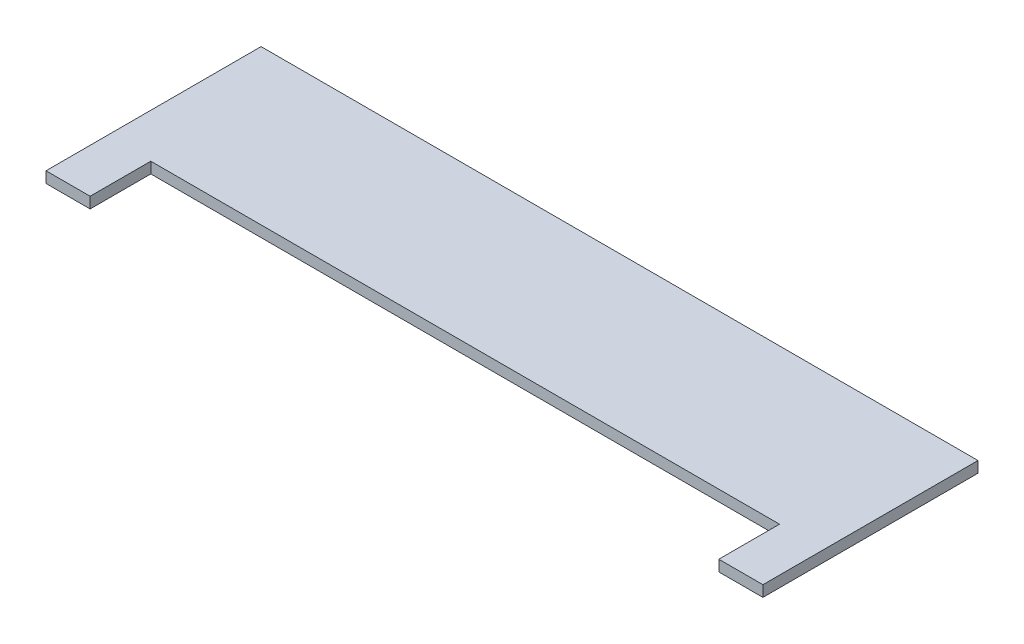
ISO-10303-21;
HEADER;
FILE_DESCRIPTION(('STEP AP214'),'2;1');
FILE_NAME('part.step','',(''),(''),'','','');
FILE_SCHEMA(('AUTOMOTIVE_DESIGN { 1 0 10303 214 1 1 1 1 }'));
ENDSEC;
DATA;
#1=APPLICATION_CONTEXT('core data for automotive mechanical design processes');
#2=APPLICATION_PROTOCOL_DEFINITION('international standard','automotive_design',2000,#1);
#3=PRODUCT_CONTEXT('',#1,'mechanical');
#4=PRODUCT('Part','Part','',(#3));
#5=PRODUCT_RELATED_PRODUCT_CATEGORY('part','',(#4));
#6=PRODUCT_DEFINITION_FORMATION('','',#4);
#7=PRODUCT_DEFINITION_CONTEXT('part definition',#1,'design');
#8=PRODUCT_DEFINITION('design','',#6,#7);
#9=PRODUCT_DEFINITION_SHAPE('','',#8);
#10=(LENGTH_UNIT() NAMED_UNIT(*) SI_UNIT(.MILLI.,.METRE.));
#11=(NAMED_UNIT(*) PLANE_ANGLE_UNIT() SI_UNIT($,.RADIAN.));
#12=(NAMED_UNIT(*) SI_UNIT($,.STERADIAN.) SOLID_ANGLE_UNIT());
#13=UNCERTAINTY_MEASURE_WITH_UNIT(LENGTH_MEASURE(1.E-05),#10,'distance_accuracy_value','');
#14=(GEOMETRIC_REPRESENTATION_CONTEXT(3) GLOBAL_UNCERTAINTY_ASSIGNED_CONTEXT((#13)) GLOBAL_UNIT_ASSIGNED_CONTEXT((#10,
#11,#12)) REPRESENTATION_CONTEXT('',''));
#15=CARTESIAN_POINT('',(0.,0.,0.));
#16=DIRECTION('',(0.,0.,1.));
#17=DIRECTION('',(1.,0.,0.));
#18=AXIS2_PLACEMENT_3D('',#15,#16,#17);
#19=CARTESIAN_POINT('',(32.5,181.05,0.));
#20=DIRECTION('',(0.,0.,1.));
#21=DIRECTION('',(1.,0.,0.));
#22=AXIS2_PLACEMENT_3D('',#19,#20,#21);
#23=PLANE('',#22);
#24=DIRECTION('',(-1.,0.,0.));
#25=VECTOR('',#24,1.);
#26=CARTESIAN_POINT('',(32.5,180.05,0.));
#27=LINE('',#26,#25);
#28=CARTESIAN_POINT('',(32.5,180.05,0.));
#29=VERTEX_POINT('',#28);
#30=CARTESIAN_POINT('',(-32.5,180.05,0.));
#31=VERTEX_POINT('',#30);
#32=EDGE_CURVE('E144',#29,#31,#27,.T.);
#33=ORIENTED_EDGE('',*,*,#32,.T.);
#34=DIRECTION('',(0.,-1.,0.));
#35=VECTOR('',#34,1.);
#36=CARTESIAN_POINT('',(-32.5,181.05,0.));
#37=LINE('',#36,#35);
#38=CARTESIAN_POINT('',(-32.5,181.05,0.));
#39=VERTEX_POINT('',#38);
#40=EDGE_CURVE('E11',#39,#31,#37,.T.);
#41=ORIENTED_EDGE('',*,*,#40,.F.);
#42=DIRECTION('',(-1.,0.,0.));
#43=VECTOR('',#42,1.);
#44=CARTESIAN_POINT('',(32.5,181.05,0.));
#45=LINE('',#44,#43);
#46=CARTESIAN_POINT('',(32.5,181.05,0.));
#47=VERTEX_POINT('',#46);
#48=EDGE_CURVE('E166',#47,#39,#45,.T.);
#49=ORIENTED_EDGE('',*,*,#48,.F.);
#50=DIRECTION('',(0.,-1.,0.));
#51=VECTOR('',#50,1.);
#52=CARTESIAN_POINT('',(32.5,181.05,0.));
#53=LINE('',#52,#51);
#54=EDGE_CURVE('E140',#47,#29,#53,.T.);
#55=ORIENTED_EDGE('',*,*,#54,.T.);
#56=EDGE_LOOP('',(#33,#41,#49,#55));
#57=FACE_BOUND('',#56,.T.);
#58=ADVANCED_FACE('F42',(#57),#23,.F.);
#59=CARTESIAN_POINT('',(-32.5,181.05,0.));
#60=DIRECTION('',(1.,0.,0.));
#61=DIRECTION('',(0.,0.,-1.));
#62=AXIS2_PLACEMENT_3D('',#59,#60,#61);
#63=PLANE('',#62);
#64=DIRECTION('',(0.,0.,1.));
#65=VECTOR('',#64,1.);
#66=CARTESIAN_POINT('',(-32.5,180.05,0.));
#67=LINE('',#66,#65);
#68=CARTESIAN_POINT('',(-32.5,180.05,19.5));
#69=VERTEX_POINT('',#68);
#70=EDGE_CURVE('E148',#31,#69,#67,.T.);
#71=ORIENTED_EDGE('',*,*,#70,.T.);
#72=DIRECTION('',(0.,-1.,0.));
#73=VECTOR('',#72,1.);
#74=CARTESIAN_POINT('',(-32.5,181.05,19.5));
#75=LINE('',#74,#73);
#76=CARTESIAN_POINT('',(-32.5,181.05,19.5));
#77=VERTEX_POINT('',#76);
#78=EDGE_CURVE('E51',#77,#69,#75,.T.);
#79=ORIENTED_EDGE('',*,*,#78,.F.);
#80=DIRECTION('',(0.,0.,1.));
#81=VECTOR('',#80,1.);
#82=CARTESIAN_POINT('',(-32.5,181.05,0.));
#83=LINE('',#82,#81);
#84=EDGE_CURVE('E102',#39,#77,#83,.T.);
#85=ORIENTED_EDGE('',*,*,#84,.F.);
#86=ORIENTED_EDGE('',*,*,#40,.T.);
#87=EDGE_LOOP('',(#71,#79,#85,#86));
#88=FACE_BOUND('',#87,.T.);
#89=ADVANCED_FACE('F215',(#88),#63,.F.);
#90=CARTESIAN_POINT('',(-32.5,181.05,19.5));
#91=DIRECTION('',(0.,0.,-1.));
#92=DIRECTION('',(-1.,0.,0.));
#93=AXIS2_PLACEMENT_3D('',#90,#91,#92);
#94=PLANE('',#93);
#95=DIRECTION('',(1.,0.,0.));
#96=VECTOR('',#95,1.);
#97=CARTESIAN_POINT('',(-32.5,180.05,19.5));
#98=LINE('',#97,#96);
#99=CARTESIAN_POINT('',(-28.5,180.05,19.5));
#100=VERTEX_POINT('',#99);
#101=EDGE_CURVE('E151',#69,#100,#98,.T.);
#102=ORIENTED_EDGE('',*,*,#101,.T.);
#103=DIRECTION('',(0.,-1.,0.));
#104=VECTOR('',#103,1.);
#105=CARTESIAN_POINT('',(-28.5,181.05,19.5));
#106=LINE('',#105,#104);
#107=CARTESIAN_POINT('',(-28.5,181.05,19.5));
#108=VERTEX_POINT('',#107);
#109=EDGE_CURVE('E177',#108,#100,#106,.T.);
#110=ORIENTED_EDGE('',*,*,#109,.F.);
#111=DIRECTION('',(1.,0.,0.));
#112=VECTOR('',#111,1.);
#113=CARTESIAN_POINT('',(-32.5,181.05,19.5));
#114=LINE('',#113,#112);
#115=EDGE_CURVE('E189',#77,#108,#114,.T.);
#116=ORIENTED_EDGE('',*,*,#115,.F.);
#117=ORIENTED_EDGE('',*,*,#78,.T.);
#118=EDGE_LOOP('',(#102,#110,#116,#117));
#119=FACE_BOUND('',#118,.T.);
#120=ADVANCED_FACE('F187',(#119),#94,.F.);
#121=CARTESIAN_POINT('',(-28.5,181.05,19.5));
#122=DIRECTION('',(-1.,0.,0.));
#123=DIRECTION('',(0.,0.,1.));
#124=AXIS2_PLACEMENT_3D('',#121,#122,#123);
#125=PLANE('',#124);
#126=DIRECTION('',(0.,0.,-1.));
#127=VECTOR('',#126,1.);
#128=CARTESIAN_POINT('',(-28.5,180.05,19.5));
#129=LINE('',#128,#127);
#130=CARTESIAN_POINT('',(-28.5,180.05,14.));
#131=VERTEX_POINT('',#130);
#132=EDGE_CURVE('E154',#100,#131,#129,.T.);
#133=ORIENTED_EDGE('',*,*,#132,.T.);
#134=DIRECTION('',(0.,-1.,0.));
#135=VECTOR('',#134,1.);
#136=CARTESIAN_POINT('',(-28.5,181.05,14.));
#137=LINE('',#136,#135);
#138=CARTESIAN_POINT('',(-28.5,181.05,14.));
#139=VERTEX_POINT('',#138);
#140=EDGE_CURVE('E173',#139,#131,#137,.T.);
#141=ORIENTED_EDGE('',*,*,#140,.F.);
#142=DIRECTION('',(0.,0.,-1.));
#143=VECTOR('',#142,1.);
#144=CARTESIAN_POINT('',(-28.5,181.05,19.5));
#145=LINE('',#144,#143);
#146=EDGE_CURVE('E201',#108,#139,#145,.T.);
#147=ORIENTED_EDGE('',*,*,#146,.F.);
#148=ORIENTED_EDGE('',*,*,#109,.T.);
#149=EDGE_LOOP('',(#133,#141,#147,#148));
#150=FACE_BOUND('',#149,.T.);
#151=ADVANCED_FACE('F197',(#150),#125,.F.);
#152=CARTESIAN_POINT('',(-28.5,181.05,14.));
#153=DIRECTION('',(0.,0.,-1.));
#154=DIRECTION('',(-1.,0.,0.));
#155=AXIS2_PLACEMENT_3D('',#152,#153,#154);
#156=PLANE('',#155);
#157=DIRECTION('',(1.,0.,0.));
#158=VECTOR('',#157,1.);
#159=CARTESIAN_POINT('',(-28.5,180.05,14.));
#160=LINE('',#159,#158);
#161=CARTESIAN_POINT('',(28.5,180.05,14.));
#162=VERTEX_POINT('',#161);
#163=EDGE_CURVE('E157',#131,#162,#160,.T.);
#164=ORIENTED_EDGE('',*,*,#163,.T.);
#165=DIRECTION('',(0.,-1.,0.));
#166=VECTOR('',#165,1.);
#167=CARTESIAN_POINT('',(28.5,181.05,14.));
#168=LINE('',#167,#166);
#169=CARTESIAN_POINT('',(28.5,181.05,14.));
#170=VERTEX_POINT('',#169);
#171=EDGE_CURVE('E132',#170,#162,#168,.T.);
#172=ORIENTED_EDGE('',*,*,#171,.F.);
#173=DIRECTION('',(1.,0.,0.));
#174=VECTOR('',#173,1.);
#175=CARTESIAN_POINT('',(-28.5,181.05,14.));
#176=LINE('',#175,#174);
#177=EDGE_CURVE('E121',#139,#170,#176,.T.);
#178=ORIENTED_EDGE('',*,*,#177,.F.);
#179=ORIENTED_EDGE('',*,*,#140,.T.);
#180=EDGE_LOOP('',(#164,#172,#178,#179));
#181=FACE_BOUND('',#180,.T.);
#182=ADVANCED_FACE('F200',(#181),#156,.F.);
#183=CARTESIAN_POINT('',(28.5,181.05,14.));
#184=DIRECTION('',(1.,0.,0.));
#185=DIRECTION('',(0.,0.,-1.));
#186=AXIS2_PLACEMENT_3D('',#183,#184,#185);
#187=PLANE('',#186);
#188=DIRECTION('',(0.,0.,1.));
#189=VECTOR('',#188,1.);
#190=CARTESIAN_POINT('',(28.5,180.05,14.));
#191=LINE('',#190,#189);
#192=CARTESIAN_POINT('',(28.5,180.05,19.5));
#193=VERTEX_POINT('',#192);
#194=EDGE_CURVE('E130',#162,#193,#191,.T.);
#195=ORIENTED_EDGE('',*,*,#194,.T.);
#196=DIRECTION('',(0.,-1.,0.));
#197=VECTOR('',#196,1.);
#198=CARTESIAN_POINT('',(28.5,181.05,19.5));
#199=LINE('',#198,#197);
#200=CARTESIAN_POINT('',(28.5,181.05,19.5));
#201=VERTEX_POINT('',#200);
#202=EDGE_CURVE('E127',#201,#193,#199,.T.);
#203=ORIENTED_EDGE('',*,*,#202,.F.);
#204=DIRECTION('',(0.,0.,1.));
#205=VECTOR('',#204,1.);
#206=CARTESIAN_POINT('',(28.5,181.05,14.));
#207=LINE('',#206,#205);
#208=EDGE_CURVE('E115',#170,#201,#207,.T.);
#209=ORIENTED_EDGE('',*,*,#208,.F.);
#210=ORIENTED_EDGE('',*,*,#171,.T.);
#211=EDGE_LOOP('',(#195,#203,#209,#210));
#212=FACE_BOUND('',#211,.T.);
#213=ADVANCED_FACE('F128',(#212),#187,.F.);
#214=CARTESIAN_POINT('',(28.5,181.05,19.5));
#215=DIRECTION('',(0.,0.,-1.));
#216=DIRECTION('',(-1.,0.,0.));
#217=AXIS2_PLACEMENT_3D('',#214,#215,#216);
#218=PLANE('',#217);
#219=DIRECTION('',(1.,0.,0.));
#220=VECTOR('',#219,1.);
#221=CARTESIAN_POINT('',(28.5,180.05,19.5));
#222=LINE('',#221,#220);
#223=CARTESIAN_POINT('',(32.5,180.05,19.5));
#224=VERTEX_POINT('',#223);
#225=EDGE_CURVE('E88',#193,#224,#222,.T.);
#226=ORIENTED_EDGE('',*,*,#225,.T.);
#227=DIRECTION('',(0.,-1.,0.));
#228=VECTOR('',#227,1.);
#229=CARTESIAN_POINT('',(32.5,181.05,19.5));
#230=LINE('',#229,#228);
#231=CARTESIAN_POINT('',(32.5,181.05,19.5));
#232=VERTEX_POINT('',#231);
#233=EDGE_CURVE('E133',#232,#224,#230,.T.);
#234=ORIENTED_EDGE('',*,*,#233,.F.);
#235=DIRECTION('',(1.,0.,0.));
#236=VECTOR('',#235,1.);
#237=CARTESIAN_POINT('',(28.5,181.05,19.5));
#238=LINE('',#237,#236);
#239=EDGE_CURVE('E119',#201,#232,#238,.T.);
#240=ORIENTED_EDGE('',*,*,#239,.F.);
#241=ORIENTED_EDGE('',*,*,#202,.T.);
#242=EDGE_LOOP('',(#226,#234,#240,#241));
#243=FACE_BOUND('',#242,.T.);
#244=ADVANCED_FACE('F135',(#243),#218,.F.);
#245=CARTESIAN_POINT('',(32.5,181.05,19.5));
#246=DIRECTION('',(-1.,0.,0.));
#247=DIRECTION('',(0.,0.,1.));
#248=AXIS2_PLACEMENT_3D('',#245,#246,#247);
#249=PLANE('',#248);
#250=DIRECTION('',(0.,0.,-1.));
#251=VECTOR('',#250,1.);
#252=CARTESIAN_POINT('',(32.5,180.05,19.5));
#253=LINE('',#252,#251);
#254=EDGE_CURVE('E94',#224,#29,#253,.T.);
#255=ORIENTED_EDGE('',*,*,#254,.T.);
#256=ORIENTED_EDGE('',*,*,#54,.F.);
#257=DIRECTION('',(0.,0.,-1.));
#258=VECTOR('',#257,1.);
#259=CARTESIAN_POINT('',(32.5,181.05,19.5));
#260=LINE('',#259,#258);
#261=EDGE_CURVE('E59',#232,#47,#260,.T.);
#262=ORIENTED_EDGE('',*,*,#261,.F.);
#263=ORIENTED_EDGE('',*,*,#233,.T.);
#264=EDGE_LOOP('',(#255,#256,#262,#263));
#265=FACE_BOUND('',#264,.T.);
#266=ADVANCED_FACE('F232',(#265),#249,.F.);
#267=CARTESIAN_POINT('',(0.,181.05,0.));
#268=DIRECTION('',(0.,1.,0.));
#269=DIRECTION('',(0.,0.,1.));
#270=AXIS2_PLACEMENT_3D('',#267,#268,#269);
#271=PLANE('',#270);
#272=ORIENTED_EDGE('',*,*,#48,.T.);
#273=ORIENTED_EDGE('',*,*,#84,.T.);
#274=ORIENTED_EDGE('',*,*,#115,.T.);
#275=ORIENTED_EDGE('',*,*,#146,.T.);
#276=ORIENTED_EDGE('',*,*,#177,.T.);
#277=ORIENTED_EDGE('',*,*,#208,.T.);
#278=ORIENTED_EDGE('',*,*,#239,.T.);
#279=ORIENTED_EDGE('',*,*,#261,.T.);
#280=EDGE_LOOP('',(#272,#273,#274,#275,#276,#277,#278,#279));
#281=FACE_BOUND('',#280,.T.);
#282=ADVANCED_FACE('F117',(#281),#271,.T.);
#283=CARTESIAN_POINT('',(0.,180.05,0.));
#284=DIRECTION('',(0.,1.,0.));
#285=DIRECTION('',(0.,0.,1.));
#286=AXIS2_PLACEMENT_3D('',#283,#284,#285);
#287=PLANE('',#286);
#288=ORIENTED_EDGE('',*,*,#32,.F.);
#289=ORIENTED_EDGE('',*,*,#254,.F.);
#290=ORIENTED_EDGE('',*,*,#225,.F.);
#291=ORIENTED_EDGE('',*,*,#194,.F.);
#292=ORIENTED_EDGE('',*,*,#163,.F.);
#293=ORIENTED_EDGE('',*,*,#132,.F.);
#294=ORIENTED_EDGE('',*,*,#101,.F.);
#295=ORIENTED_EDGE('',*,*,#70,.F.);
#296=EDGE_LOOP('',(#288,#289,#290,#291,#292,#293,#294,#295));
#297=FACE_BOUND('',#296,.T.);
#298=ADVANCED_FACE('F193',(#297),#287,.F.);
#299=CLOSED_SHELL('',(#58,#89,#120,#151,#182,#213,#244,#266,#282,#298));
#300=MANIFOLD_SOLID_BREP('B2',#299);
#301=ADVANCED_BREP_SHAPE_REPRESENTATION('',(#18,#300),#14);
#302=SHAPE_DEFINITION_REPRESENTATION(#9,#301);
ENDSEC;
END-ISO-10303-21;
